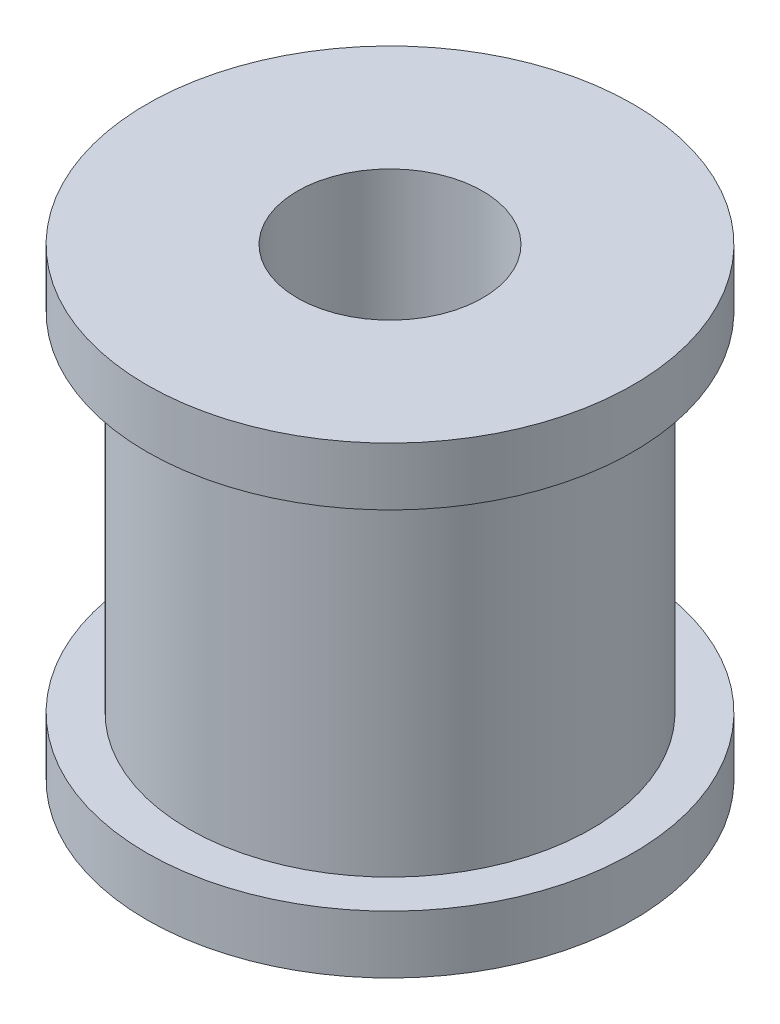
ISO-10303-21;
HEADER;
FILE_DESCRIPTION(('STEP AP214'),'2;1');
FILE_NAME('part.step','',(''),(''),'','','');
FILE_SCHEMA(('AUTOMOTIVE_DESIGN { 1 0 10303 214 1 1 1 1 }'));
ENDSEC;
DATA;
#1=APPLICATION_CONTEXT('core data for automotive mechanical design processes');
#2=APPLICATION_PROTOCOL_DEFINITION('international standard','automotive_design',2000,#1);
#3=PRODUCT_CONTEXT('',#1,'mechanical');
#4=PRODUCT('Part','Part','',(#3));
#5=PRODUCT_RELATED_PRODUCT_CATEGORY('part','',(#4));
#6=PRODUCT_DEFINITION_FORMATION('','',#4);
#7=PRODUCT_DEFINITION_CONTEXT('part definition',#1,'design');
#8=PRODUCT_DEFINITION('design','',#6,#7);
#9=PRODUCT_DEFINITION_SHAPE('','',#8);
#10=(LENGTH_UNIT() NAMED_UNIT(*) SI_UNIT(.MILLI.,.METRE.));
#11=(NAMED_UNIT(*) PLANE_ANGLE_UNIT() SI_UNIT($,.RADIAN.));
#12=(NAMED_UNIT(*) SI_UNIT($,.STERADIAN.) SOLID_ANGLE_UNIT());
#13=UNCERTAINTY_MEASURE_WITH_UNIT(LENGTH_MEASURE(1.E-05),#10,'distance_accuracy_value','');
#14=(GEOMETRIC_REPRESENTATION_CONTEXT(3) GLOBAL_UNCERTAINTY_ASSIGNED_CONTEXT((#13)) GLOBAL_UNIT_ASSIGNED_CONTEXT((#10,
#11,#12)) REPRESENTATION_CONTEXT('',''));
#15=CARTESIAN_POINT('',(0.,0.,0.));
#16=DIRECTION('',(0.,0.,1.));
#17=DIRECTION('',(1.,0.,0.));
#18=AXIS2_PLACEMENT_3D('',#15,#16,#17);
#19=CARTESIAN_POINT('',(0.,12.3387096774194,0.));
#20=DIRECTION('',(0.,1.,0.));
#21=DIRECTION('',(0.,0.,1.));
#22=AXIS2_PLACEMENT_3D('',#19,#20,#21);
#23=CYLINDRICAL_SURFACE('',#22,4.);
#24=CARTESIAN_POINT('',(0.,-7.66129032258065,0.));
#25=DIRECTION('',(0.,1.,0.));
#26=DIRECTION('',(0.,0.,1.));
#27=AXIS2_PLACEMENT_3D('',#24,#25,#26);
#28=CIRCLE('',#27,4.);
#29=CARTESIAN_POINT('',(0.,-7.66129032258065,4.));
#30=VERTEX_POINT('',#29);
#31=EDGE_CURVE('E10',#30,#30,#28,.T.);
#32=ORIENTED_EDGE('',*,*,#31,.F.);
#33=EDGE_LOOP('',(#32));
#34=FACE_BOUND('',#33,.T.);
#35=CARTESIAN_POINT('',(0.,12.3387096774194,0.));
#36=DIRECTION('',(0.,1.,0.));
#37=DIRECTION('',(0.,0.,1.));
#38=AXIS2_PLACEMENT_3D('',#35,#36,#37);
#39=CIRCLE('',#38,4.);
#40=CARTESIAN_POINT('',(0.,12.3387096774194,4.));
#41=VERTEX_POINT('',#40);
#42=EDGE_CURVE('E59',#41,#41,#39,.T.);
#43=ORIENTED_EDGE('',*,*,#42,.T.);
#44=EDGE_LOOP('',(#43));
#45=FACE_BOUND('',#44,.T.);
#46=ADVANCED_FACE('F31',(#34,#45),#23,.F.);
#47=CARTESIAN_POINT('',(4.,-7.66129032258065,0.));
#48=DIRECTION('',(0.,1.,0.));
#49=DIRECTION('',(0.,0.,1.));
#50=AXIS2_PLACEMENT_3D('',#47,#48,#49);
#51=PLANE('',#50);
#52=CARTESIAN_POINT('',(0.,-7.66129032258065,0.));
#53=DIRECTION('',(0.,1.,0.));
#54=DIRECTION('',(0.,0.,1.));
#55=AXIS2_PLACEMENT_3D('',#52,#53,#54);
#56=CIRCLE('',#55,10.5);
#57=CARTESIAN_POINT('',(0.,-7.66129032258065,10.5));
#58=VERTEX_POINT('',#57);
#59=EDGE_CURVE('E37',#58,#58,#56,.T.);
#60=ORIENTED_EDGE('',*,*,#59,.F.);
#61=EDGE_LOOP('',(#60));
#62=FACE_BOUND('',#61,.T.);
#63=ORIENTED_EDGE('',*,*,#31,.T.);
#64=EDGE_LOOP('',(#63));
#65=FACE_BOUND('',#64,.T.);
#66=ADVANCED_FACE('F96',(#62,#65),#51,.F.);
#67=CARTESIAN_POINT('',(0.,12.3387096774194,0.));
#68=DIRECTION('',(0.,1.,0.));
#69=DIRECTION('',(0.,0.,1.));
#70=AXIS2_PLACEMENT_3D('',#67,#68,#69);
#71=CYLINDRICAL_SURFACE('',#70,10.5);
#72=CARTESIAN_POINT('',(0.,-5.16129032258065,0.));
#73=DIRECTION('',(0.,1.,0.));
#74=DIRECTION('',(0.,0.,1.));
#75=AXIS2_PLACEMENT_3D('',#72,#73,#74);
#76=CIRCLE('',#75,10.5);
#77=CARTESIAN_POINT('',(0.,-5.16129032258065,10.5));
#78=VERTEX_POINT('',#77);
#79=EDGE_CURVE('E41',#78,#78,#76,.T.);
#80=ORIENTED_EDGE('',*,*,#79,.F.);
#81=EDGE_LOOP('',(#80));
#82=FACE_BOUND('',#81,.T.);
#83=ORIENTED_EDGE('',*,*,#59,.T.);
#84=EDGE_LOOP('',(#83));
#85=FACE_BOUND('',#84,.T.);
#86=ADVANCED_FACE('F91',(#82,#85),#71,.T.);
#87=CARTESIAN_POINT('',(10.5,-5.16129032258065,0.));
#88=DIRECTION('',(0.,-1.,0.));
#89=DIRECTION('',(0.,0.,-1.));
#90=AXIS2_PLACEMENT_3D('',#87,#88,#89);
#91=PLANE('',#90);
#92=CARTESIAN_POINT('',(0.,-5.16129032258065,0.));
#93=DIRECTION('',(0.,1.,0.));
#94=DIRECTION('',(0.,0.,1.));
#95=AXIS2_PLACEMENT_3D('',#92,#93,#94);
#96=CIRCLE('',#95,8.7);
#97=CARTESIAN_POINT('',(0.,-5.16129032258065,8.7));
#98=VERTEX_POINT('',#97);
#99=EDGE_CURVE('E45',#98,#98,#96,.T.);
#100=ORIENTED_EDGE('',*,*,#99,.F.);
#101=EDGE_LOOP('',(#100));
#102=FACE_BOUND('',#101,.T.);
#103=ORIENTED_EDGE('',*,*,#79,.T.);
#104=EDGE_LOOP('',(#103));
#105=FACE_BOUND('',#104,.T.);
#106=ADVANCED_FACE('F85',(#102,#105),#91,.F.);
#107=CARTESIAN_POINT('',(0.,12.3387096774194,0.));
#108=DIRECTION('',(0.,1.,0.));
#109=DIRECTION('',(0.,0.,1.));
#110=AXIS2_PLACEMENT_3D('',#107,#108,#109);
#111=CYLINDRICAL_SURFACE('',#110,8.7);
#112=CARTESIAN_POINT('',(0.,9.83870967741935,0.));
#113=DIRECTION('',(0.,1.,0.));
#114=DIRECTION('',(0.,0.,1.));
#115=AXIS2_PLACEMENT_3D('',#112,#113,#114);
#116=CIRCLE('',#115,8.7);
#117=CARTESIAN_POINT('',(0.,9.83870967741935,8.7));
#118=VERTEX_POINT('',#117);
#119=EDGE_CURVE('E50',#118,#118,#116,.T.);
#120=ORIENTED_EDGE('',*,*,#119,.F.);
#121=EDGE_LOOP('',(#120));
#122=FACE_BOUND('',#121,.T.);
#123=ORIENTED_EDGE('',*,*,#99,.T.);
#124=EDGE_LOOP('',(#123));
#125=FACE_BOUND('',#124,.T.);
#126=ADVANCED_FACE('F79',(#122,#125),#111,.T.);
#127=CARTESIAN_POINT('',(8.7,9.83870967741935,0.));
#128=DIRECTION('',(0.,1.,0.));
#129=DIRECTION('',(0.,0.,1.));
#130=AXIS2_PLACEMENT_3D('',#127,#128,#129);
#131=PLANE('',#130);
#132=CARTESIAN_POINT('',(0.,9.83870967741935,0.));
#133=DIRECTION('',(0.,1.,0.));
#134=DIRECTION('',(0.,0.,1.));
#135=AXIS2_PLACEMENT_3D('',#132,#133,#134);
#136=CIRCLE('',#135,10.5);
#137=CARTESIAN_POINT('',(0.,9.83870967741935,10.5));
#138=VERTEX_POINT('',#137);
#139=EDGE_CURVE('E53',#138,#138,#136,.T.);
#140=ORIENTED_EDGE('',*,*,#139,.F.);
#141=EDGE_LOOP('',(#140));
#142=FACE_BOUND('',#141,.T.);
#143=ORIENTED_EDGE('',*,*,#119,.T.);
#144=EDGE_LOOP('',(#143));
#145=FACE_BOUND('',#144,.T.);
#146=ADVANCED_FACE('F73',(#142,#145),#131,.F.);
#147=CARTESIAN_POINT('',(0.,12.3387096774194,0.));
#148=DIRECTION('',(0.,1.,0.));
#149=DIRECTION('',(0.,0.,1.));
#150=AXIS2_PLACEMENT_3D('',#147,#148,#149);
#151=CYLINDRICAL_SURFACE('',#150,10.5);
#152=CARTESIAN_POINT('',(0.,12.3387096774194,0.));
#153=DIRECTION('',(0.,1.,0.));
#154=DIRECTION('',(0.,0.,1.));
#155=AXIS2_PLACEMENT_3D('',#152,#153,#154);
#156=CIRCLE('',#155,10.5);
#157=CARTESIAN_POINT('',(0.,12.3387096774194,10.5));
#158=VERTEX_POINT('',#157);
#159=EDGE_CURVE('E56',#158,#158,#156,.T.);
#160=ORIENTED_EDGE('',*,*,#159,.F.);
#161=EDGE_LOOP('',(#160));
#162=FACE_BOUND('',#161,.T.);
#163=ORIENTED_EDGE('',*,*,#139,.T.);
#164=EDGE_LOOP('',(#163));
#165=FACE_BOUND('',#164,.T.);
#166=ADVANCED_FACE('F67',(#162,#165),#151,.T.);
#167=CARTESIAN_POINT('',(10.5,12.3387096774194,0.));
#168=DIRECTION('',(0.,-1.,0.));
#169=DIRECTION('',(0.,0.,-1.));
#170=AXIS2_PLACEMENT_3D('',#167,#168,#169);
#171=PLANE('',#170);
#172=ORIENTED_EDGE('',*,*,#42,.F.);
#173=EDGE_LOOP('',(#172));
#174=FACE_BOUND('',#173,.T.);
#175=ORIENTED_EDGE('',*,*,#159,.T.);
#176=EDGE_LOOP('',(#175));
#177=FACE_BOUND('',#176,.T.);
#178=ADVANCED_FACE('F64',(#174,#177),#171,.F.);
#179=CLOSED_SHELL('',(#46,#66,#86,#106,#126,#146,#166,#178));
#180=MANIFOLD_SOLID_BREP('B2',#179);
#181=ADVANCED_BREP_SHAPE_REPRESENTATION('',(#18,#180),#14);
#182=SHAPE_DEFINITION_REPRESENTATION(#9,#181);
ENDSEC;
END-ISO-10303-21;
